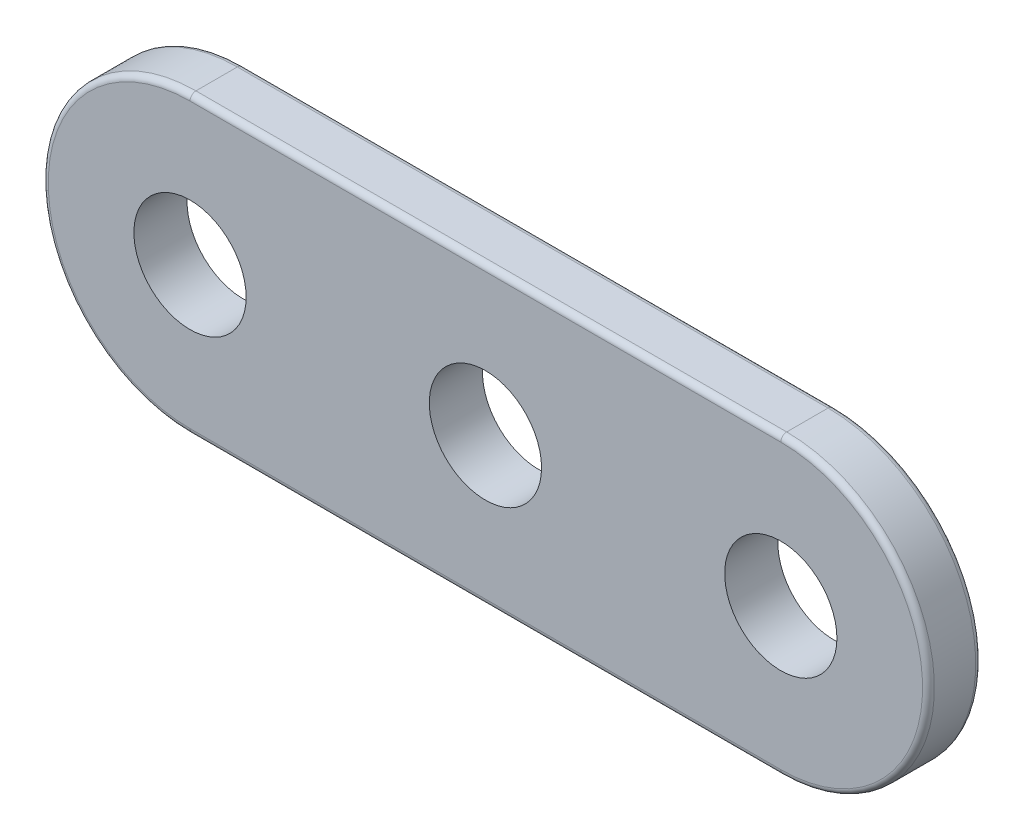
ISO-10303-21;
HEADER;
FILE_DESCRIPTION(('STEP AP214'),'2;1');
FILE_NAME('part.step','',(''),(''),'','','');
FILE_SCHEMA(('AUTOMOTIVE_DESIGN { 1 0 10303 214 1 1 1 1 }'));
ENDSEC;
DATA;
#1=APPLICATION_CONTEXT('core data for automotive mechanical design processes');
#2=APPLICATION_PROTOCOL_DEFINITION('international standard','automotive_design',2000,#1);
#3=PRODUCT_CONTEXT('',#1,'mechanical');
#4=PRODUCT('Part','Part','',(#3));
#5=PRODUCT_RELATED_PRODUCT_CATEGORY('part','',(#4));
#6=PRODUCT_DEFINITION_FORMATION('','',#4);
#7=PRODUCT_DEFINITION_CONTEXT('part definition',#1,'design');
#8=PRODUCT_DEFINITION('design','',#6,#7);
#9=PRODUCT_DEFINITION_SHAPE('','',#8);
#10=(LENGTH_UNIT() NAMED_UNIT(*) SI_UNIT(.MILLI.,.METRE.));
#11=(NAMED_UNIT(*) PLANE_ANGLE_UNIT() SI_UNIT($,.RADIAN.));
#12=(NAMED_UNIT(*) SI_UNIT($,.STERADIAN.) SOLID_ANGLE_UNIT());
#13=UNCERTAINTY_MEASURE_WITH_UNIT(LENGTH_MEASURE(1.E-05),#10,'distance_accuracy_value','');
#14=(GEOMETRIC_REPRESENTATION_CONTEXT(3) GLOBAL_UNCERTAINTY_ASSIGNED_CONTEXT((#13)) GLOBAL_UNIT_ASSIGNED_CONTEXT((#10,
#11,#12)) REPRESENTATION_CONTEXT('',''));
#15=CARTESIAN_POINT('',(0.,0.,0.));
#16=DIRECTION('',(0.,0.,1.));
#17=DIRECTION('',(1.,0.,0.));
#18=AXIS2_PLACEMENT_3D('',#15,#16,#17);
#19=CARTESIAN_POINT('',(-12.7,0.,2.286));
#20=DIRECTION('',(0.,0.,-1.));
#21=DIRECTION('',(-1.,0.,0.));
#22=AXIS2_PLACEMENT_3D('',#19,#20,#21);
#23=CYLINDRICAL_SURFACE('',#22,6.35);
#24=DIRECTION('',(0.,0.,-1.));
#25=VECTOR('',#24,1.);
#26=CARTESIAN_POINT('',(-12.7,6.35,2.286));
#27=LINE('',#26,#25);
#28=CARTESIAN_POINT('',(-12.7,6.35,2.032));
#29=VERTEX_POINT('',#28);
#30=CARTESIAN_POINT('',(-12.7,6.35,0.254));
#31=VERTEX_POINT('',#30);
#32=EDGE_CURVE('E102',#29,#31,#27,.T.);
#33=ORIENTED_EDGE('',*,*,#32,.T.);
#34=CARTESIAN_POINT('',(-12.7,0.,0.254));
#35=DIRECTION('',(0.,0.,1.));
#36=DIRECTION('',(1.,0.,0.));
#37=AXIS2_PLACEMENT_3D('',#34,#35,#36);
#38=CIRCLE('',#37,6.35);
#39=CARTESIAN_POINT('',(-12.7,-6.35,0.254));
#40=VERTEX_POINT('',#39);
#41=EDGE_CURVE('E199',#31,#40,#38,.T.);
#42=ORIENTED_EDGE('',*,*,#41,.T.);
#43=DIRECTION('',(0.,0.,-1.));
#44=VECTOR('',#43,1.);
#45=CARTESIAN_POINT('',(-12.7,-6.35,2.286));
#46=LINE('',#45,#44);
#47=CARTESIAN_POINT('',(-12.7,-6.35,2.032));
#48=VERTEX_POINT('',#47);
#49=EDGE_CURVE('E128',#48,#40,#46,.T.);
#50=ORIENTED_EDGE('',*,*,#49,.F.);
#51=CARTESIAN_POINT('',(-12.7,0.,2.032));
#52=DIRECTION('',(0.,0.,1.));
#53=DIRECTION('',(1.,0.,0.));
#54=AXIS2_PLACEMENT_3D('',#51,#52,#53);
#55=CIRCLE('',#54,6.35);
#56=EDGE_CURVE('E197',#48,#29,#55,.F.);
#57=ORIENTED_EDGE('',*,*,#56,.T.);
#58=EDGE_LOOP('',(#33,#42,#50,#57));
#59=FACE_BOUND('',#58,.T.);
#60=ADVANCED_FACE('F31',(#59),#23,.T.);
#61=CARTESIAN_POINT('',(-12.7,-6.35,2.286));
#62=DIRECTION('',(0.,1.,0.));
#63=DIRECTION('',(-1.,0.,0.));
#64=AXIS2_PLACEMENT_3D('',#61,#62,#63);
#65=PLANE('',#64);
#66=ORIENTED_EDGE('',*,*,#49,.T.);
#67=DIRECTION('',(1.,0.,0.));
#68=VECTOR('',#67,1.);
#69=CARTESIAN_POINT('',(-12.7,-6.35,0.254));
#70=LINE('',#69,#68);
#71=CARTESIAN_POINT('',(12.7,-6.35,0.254));
#72=VERTEX_POINT('',#71);
#73=EDGE_CURVE('E195',#40,#72,#70,.T.);
#74=ORIENTED_EDGE('',*,*,#73,.T.);
#75=DIRECTION('',(0.,0.,-1.));
#76=VECTOR('',#75,1.);
#77=CARTESIAN_POINT('',(12.7,-6.35,2.286));
#78=LINE('',#77,#76);
#79=CARTESIAN_POINT('',(12.7,-6.35,2.032));
#80=VERTEX_POINT('',#79);
#81=EDGE_CURVE('E119',#80,#72,#78,.T.);
#82=ORIENTED_EDGE('',*,*,#81,.F.);
#83=DIRECTION('',(1.,0.,0.));
#84=VECTOR('',#83,1.);
#85=CARTESIAN_POINT('',(-12.7,-6.35,2.032));
#86=LINE('',#85,#84);
#87=EDGE_CURVE('E193',#80,#48,#86,.F.);
#88=ORIENTED_EDGE('',*,*,#87,.T.);
#89=EDGE_LOOP('',(#66,#74,#82,#88));
#90=FACE_BOUND('',#89,.T.);
#91=ADVANCED_FACE('F211',(#90),#65,.F.);
#92=CARTESIAN_POINT('',(12.7,0.,2.286));
#93=DIRECTION('',(0.,0.,-1.));
#94=DIRECTION('',(-1.,0.,0.));
#95=AXIS2_PLACEMENT_3D('',#92,#93,#94);
#96=CYLINDRICAL_SURFACE('',#95,6.35);
#97=ORIENTED_EDGE('',*,*,#81,.T.);
#98=CARTESIAN_POINT('',(12.7,0.,0.254));
#99=DIRECTION('',(0.,0.,1.));
#100=DIRECTION('',(1.,0.,0.));
#101=AXIS2_PLACEMENT_3D('',#98,#99,#100);
#102=CIRCLE('',#101,6.35);
#103=CARTESIAN_POINT('',(12.7,6.35000000000001,0.254));
#104=VERTEX_POINT('',#103);
#105=EDGE_CURVE('E118',#72,#104,#102,.T.);
#106=ORIENTED_EDGE('',*,*,#105,.T.);
#107=DIRECTION('',(0.,0.,-1.));
#108=VECTOR('',#107,1.);
#109=CARTESIAN_POINT('',(12.7,6.35000000000001,2.286));
#110=LINE('',#109,#108);
#111=CARTESIAN_POINT('',(12.7,6.35000000000001,2.032));
#112=VERTEX_POINT('',#111);
#113=EDGE_CURVE('E100',#112,#104,#110,.T.);
#114=ORIENTED_EDGE('',*,*,#113,.F.);
#115=CARTESIAN_POINT('',(12.7,0.,2.032));
#116=DIRECTION('',(0.,0.,1.));
#117=DIRECTION('',(1.,0.,0.));
#118=AXIS2_PLACEMENT_3D('',#115,#116,#117);
#119=CIRCLE('',#118,6.35);
#120=EDGE_CURVE('E115',#112,#80,#119,.F.);
#121=ORIENTED_EDGE('',*,*,#120,.T.);
#122=EDGE_LOOP('',(#97,#106,#114,#121));
#123=FACE_BOUND('',#122,.T.);
#124=ADVANCED_FACE('F114',(#123),#96,.T.);
#125=CARTESIAN_POINT('',(-12.7,6.35,2.286));
#126=DIRECTION('',(0.,-1.,0.));
#127=DIRECTION('',(1.,0.,0.));
#128=AXIS2_PLACEMENT_3D('',#125,#126,#127);
#129=PLANE('',#128);
#130=ORIENTED_EDGE('',*,*,#113,.T.);
#131=DIRECTION('',(-1.,0.,0.));
#132=VECTOR('',#131,1.);
#133=CARTESIAN_POINT('',(-12.7,6.35,0.254));
#134=LINE('',#133,#132);
#135=EDGE_CURVE('E11',#104,#31,#134,.T.);
#136=ORIENTED_EDGE('',*,*,#135,.T.);
#137=ORIENTED_EDGE('',*,*,#32,.F.);
#138=DIRECTION('',(-1.,0.,0.));
#139=VECTOR('',#138,1.);
#140=CARTESIAN_POINT('',(12.7,6.35000000000001,2.032));
#141=LINE('',#140,#139);
#142=EDGE_CURVE('E40',#29,#112,#141,.F.);
#143=ORIENTED_EDGE('',*,*,#142,.T.);
#144=EDGE_LOOP('',(#130,#136,#137,#143));
#145=FACE_BOUND('',#144,.T.);
#146=ADVANCED_FACE('F99',(#145),#129,.F.);
#147=CARTESIAN_POINT('',(-12.7,0.,2.286));
#148=DIRECTION('',(0.,0.,1.));
#149=DIRECTION('',(1.,0.,0.));
#150=AXIS2_PLACEMENT_3D('',#147,#148,#149);
#151=PLANE('',#150);
#152=DIRECTION('',(1.,0.,0.));
#153=VECTOR('',#152,1.);
#154=CARTESIAN_POINT('',(12.7,-6.096,2.286));
#155=LINE('',#154,#153);
#156=CARTESIAN_POINT('',(-12.7,-6.09600000000001,2.286));
#157=VERTEX_POINT('',#156);
#158=CARTESIAN_POINT('',(12.7,-6.096,2.286));
#159=VERTEX_POINT('',#158);
#160=EDGE_CURVE('E48',#157,#159,#155,.T.);
#161=ORIENTED_EDGE('',*,*,#160,.T.);
#162=CARTESIAN_POINT('',(12.7,0.,2.286));
#163=DIRECTION('',(0.,0.,1.));
#164=DIRECTION('',(1.,0.,0.));
#165=AXIS2_PLACEMENT_3D('',#162,#163,#164);
#166=CIRCLE('',#165,6.09600000000001);
#167=CARTESIAN_POINT('',(12.7,6.09600000000001,2.286));
#168=VERTEX_POINT('',#167);
#169=EDGE_CURVE('E107',#159,#168,#166,.T.);
#170=ORIENTED_EDGE('',*,*,#169,.T.);
#171=DIRECTION('',(-1.,0.,0.));
#172=VECTOR('',#171,1.);
#173=CARTESIAN_POINT('',(-12.7,6.09600000000001,2.286));
#174=LINE('',#173,#172);
#175=CARTESIAN_POINT('',(-12.7,6.09600000000001,2.286));
#176=VERTEX_POINT('',#175);
#177=EDGE_CURVE('E131',#168,#176,#174,.T.);
#178=ORIENTED_EDGE('',*,*,#177,.T.);
#179=CARTESIAN_POINT('',(-12.7,0.,2.286));
#180=DIRECTION('',(0.,0.,1.));
#181=DIRECTION('',(1.,0.,0.));
#182=AXIS2_PLACEMENT_3D('',#179,#180,#181);
#183=CIRCLE('',#182,6.09600000000001);
#184=EDGE_CURVE('E53',#176,#157,#183,.T.);
#185=ORIENTED_EDGE('',*,*,#184,.T.);
#186=EDGE_LOOP('',(#161,#170,#178,#185));
#187=FACE_BOUND('',#186,.T.);
#188=CARTESIAN_POINT('',(12.7,0.,2.286));
#189=DIRECTION('',(0.,0.,1.));
#190=DIRECTION('',(1.,0.,0.));
#191=AXIS2_PLACEMENT_3D('',#188,#189,#190);
#192=CIRCLE('',#191,2.413);
#193=CARTESIAN_POINT('',(15.113,0.,2.286));
#194=VERTEX_POINT('',#193);
#195=EDGE_CURVE('E154',#194,#194,#192,.T.);
#196=ORIENTED_EDGE('',*,*,#195,.F.);
#197=EDGE_LOOP('',(#196));
#198=FACE_BOUND('',#197,.T.);
#199=CARTESIAN_POINT('',(0.,0.,2.286));
#200=DIRECTION('',(0.,0.,1.));
#201=DIRECTION('',(1.,0.,0.));
#202=AXIS2_PLACEMENT_3D('',#199,#200,#201);
#203=CIRCLE('',#202,2.413);
#204=CARTESIAN_POINT('',(2.413,0.,2.286));
#205=VERTEX_POINT('',#204);
#206=EDGE_CURVE('E165',#205,#205,#203,.T.);
#207=ORIENTED_EDGE('',*,*,#206,.F.);
#208=EDGE_LOOP('',(#207));
#209=FACE_BOUND('',#208,.T.);
#210=CARTESIAN_POINT('',(-12.7,0.,2.286));
#211=DIRECTION('',(0.,0.,1.));
#212=DIRECTION('',(1.,0.,0.));
#213=AXIS2_PLACEMENT_3D('',#210,#211,#212);
#214=CIRCLE('',#213,2.413);
#215=CARTESIAN_POINT('',(-10.287,0.,2.286));
#216=VERTEX_POINT('',#215);
#217=EDGE_CURVE('E171',#216,#216,#214,.T.);
#218=ORIENTED_EDGE('',*,*,#217,.F.);
#219=EDGE_LOOP('',(#218));
#220=FACE_BOUND('',#219,.T.);
#221=ADVANCED_FACE('F204',(#187,#198,#209,#220),#151,.T.);
#222=CARTESIAN_POINT('',(-12.7,0.,0.));
#223=DIRECTION('',(0.,0.,1.));
#224=DIRECTION('',(1.,0.,0.));
#225=AXIS2_PLACEMENT_3D('',#222,#223,#224);
#226=PLANE('',#225);
#227=DIRECTION('',(-1.,0.,0.));
#228=VECTOR('',#227,1.);
#229=CARTESIAN_POINT('',(-12.7,6.09600000000001,0.));
#230=LINE('',#229,#228);
#231=CARTESIAN_POINT('',(-12.7,6.09600000000001,0.));
#232=VERTEX_POINT('',#231);
#233=CARTESIAN_POINT('',(12.7,6.09600000000001,0.));
#234=VERTEX_POINT('',#233);
#235=EDGE_CURVE('E184',#232,#234,#230,.F.);
#236=ORIENTED_EDGE('',*,*,#235,.T.);
#237=CARTESIAN_POINT('',(12.7,0.,0.));
#238=DIRECTION('',(0.,0.,1.));
#239=DIRECTION('',(1.,0.,0.));
#240=AXIS2_PLACEMENT_3D('',#237,#238,#239);
#241=CIRCLE('',#240,6.09600000000001);
#242=CARTESIAN_POINT('',(12.7,-6.096,0.));
#243=VERTEX_POINT('',#242);
#244=EDGE_CURVE('E190',#234,#243,#241,.F.);
#245=ORIENTED_EDGE('',*,*,#244,.T.);
#246=DIRECTION('',(1.,0.,0.));
#247=VECTOR('',#246,1.);
#248=CARTESIAN_POINT('',(-12.7,-6.09600000000001,0.));
#249=LINE('',#248,#247);
#250=CARTESIAN_POINT('',(-12.7,-6.09600000000001,0.));
#251=VERTEX_POINT('',#250);
#252=EDGE_CURVE('E188',#243,#251,#249,.F.);
#253=ORIENTED_EDGE('',*,*,#252,.T.);
#254=CARTESIAN_POINT('',(-12.7,0.,0.));
#255=DIRECTION('',(0.,0.,1.));
#256=DIRECTION('',(1.,0.,0.));
#257=AXIS2_PLACEMENT_3D('',#254,#255,#256);
#258=CIRCLE('',#257,6.09600000000001);
#259=EDGE_CURVE('E186',#251,#232,#258,.F.);
#260=ORIENTED_EDGE('',*,*,#259,.T.);
#261=EDGE_LOOP('',(#236,#245,#253,#260));
#262=FACE_BOUND('',#261,.T.);
#263=CARTESIAN_POINT('',(12.7,0.,0.));
#264=DIRECTION('',(0.,0.,1.));
#265=DIRECTION('',(1.,0.,0.));
#266=AXIS2_PLACEMENT_3D('',#263,#264,#265);
#267=CIRCLE('',#266,2.413);
#268=CARTESIAN_POINT('',(15.113,0.,0.));
#269=VERTEX_POINT('',#268);
#270=EDGE_CURVE('E160',#269,#269,#267,.T.);
#271=ORIENTED_EDGE('',*,*,#270,.T.);
#272=EDGE_LOOP('',(#271));
#273=FACE_BOUND('',#272,.T.);
#274=CARTESIAN_POINT('',(0.,0.,0.));
#275=DIRECTION('',(0.,0.,1.));
#276=DIRECTION('',(1.,0.,0.));
#277=AXIS2_PLACEMENT_3D('',#274,#275,#276);
#278=CIRCLE('',#277,2.413);
#279=CARTESIAN_POINT('',(2.413,0.,0.));
#280=VERTEX_POINT('',#279);
#281=EDGE_CURVE('E168',#280,#280,#278,.T.);
#282=ORIENTED_EDGE('',*,*,#281,.T.);
#283=EDGE_LOOP('',(#282));
#284=FACE_BOUND('',#283,.T.);
#285=CARTESIAN_POINT('',(-12.7,0.,0.));
#286=DIRECTION('',(0.,0.,1.));
#287=DIRECTION('',(1.,0.,0.));
#288=AXIS2_PLACEMENT_3D('',#285,#286,#287);
#289=CIRCLE('',#288,2.413);
#290=CARTESIAN_POINT('',(-10.287,0.,0.));
#291=VERTEX_POINT('',#290);
#292=EDGE_CURVE('E174',#291,#291,#289,.T.);
#293=ORIENTED_EDGE('',*,*,#292,.T.);
#294=EDGE_LOOP('',(#293));
#295=FACE_BOUND('',#294,.T.);
#296=ADVANCED_FACE('F239',(#262,#273,#284,#295),#226,.F.);
#297=CARTESIAN_POINT('',(-12.7,0.,0.));
#298=DIRECTION('',(0.,0.,1.));
#299=DIRECTION('',(1.,0.,0.));
#300=AXIS2_PLACEMENT_3D('',#297,#298,#299);
#301=CYLINDRICAL_SURFACE('',#300,2.413);
#302=ORIENTED_EDGE('',*,*,#292,.F.);
#303=EDGE_LOOP('',(#302));
#304=FACE_BOUND('',#303,.T.);
#305=ORIENTED_EDGE('',*,*,#217,.T.);
#306=EDGE_LOOP('',(#305));
#307=FACE_BOUND('',#306,.T.);
#308=ADVANCED_FACE('F242',(#304,#307),#301,.F.);
#309=CARTESIAN_POINT('',(0.,0.,0.));
#310=DIRECTION('',(0.,0.,1.));
#311=DIRECTION('',(1.,0.,0.));
#312=AXIS2_PLACEMENT_3D('',#309,#310,#311);
#313=CYLINDRICAL_SURFACE('',#312,2.413);
#314=ORIENTED_EDGE('',*,*,#281,.F.);
#315=EDGE_LOOP('',(#314));
#316=FACE_BOUND('',#315,.T.);
#317=ORIENTED_EDGE('',*,*,#206,.T.);
#318=EDGE_LOOP('',(#317));
#319=FACE_BOUND('',#318,.T.);
#320=ADVANCED_FACE('F248',(#316,#319),#313,.F.);
#321=CARTESIAN_POINT('',(12.7,0.,0.));
#322=DIRECTION('',(0.,0.,1.));
#323=DIRECTION('',(1.,0.,0.));
#324=AXIS2_PLACEMENT_3D('',#321,#322,#323);
#325=CYLINDRICAL_SURFACE('',#324,2.413);
#326=ORIENTED_EDGE('',*,*,#270,.F.);
#327=EDGE_LOOP('',(#326));
#328=FACE_BOUND('',#327,.T.);
#329=ORIENTED_EDGE('',*,*,#195,.T.);
#330=EDGE_LOOP('',(#329));
#331=FACE_BOUND('',#330,.T.);
#332=ADVANCED_FACE('F252',(#328,#331),#325,.F.);
#333=CARTESIAN_POINT('',(-12.7,0.,0.254));
#334=DIRECTION('',(0.,0.,1.));
#335=DIRECTION('',(1.,0.,0.));
#336=AXIS2_PLACEMENT_3D('',#333,#334,#335);
#337=TOROIDAL_SURFACE('',#336,6.09600000000001,0.254);
#338=CARTESIAN_POINT('',(-12.7,6.09600000000001,0.254));
#339=DIRECTION('',(1.,0.,0.));
#340=DIRECTION('',(0.,0.,-1.));
#341=AXIS2_PLACEMENT_3D('',#338,#339,#340);
#342=CIRCLE('',#341,0.254);
#343=EDGE_CURVE('E147',#232,#31,#342,.T.);
#344=ORIENTED_EDGE('',*,*,#343,.F.);
#345=ORIENTED_EDGE('',*,*,#259,.F.);
#346=CARTESIAN_POINT('',(-12.7,-6.09600000000001,0.254));
#347=DIRECTION('',(1.,0.,0.));
#348=DIRECTION('',(0.,0.,-1.));
#349=AXIS2_PLACEMENT_3D('',#346,#347,#348);
#350=CIRCLE('',#349,0.254);
#351=EDGE_CURVE('E136',#40,#251,#350,.T.);
#352=ORIENTED_EDGE('',*,*,#351,.F.);
#353=ORIENTED_EDGE('',*,*,#41,.F.);
#354=EDGE_LOOP('',(#344,#345,#352,#353));
#355=FACE_BOUND('',#354,.T.);
#356=ADVANCED_FACE('F215',(#355),#337,.T.);
#357=CARTESIAN_POINT('',(-12.7,-6.09600000000001,0.254));
#358=DIRECTION('',(1.,0.,0.));
#359=DIRECTION('',(0.,1.,0.));
#360=AXIS2_PLACEMENT_3D('',#357,#358,#359);
#361=CYLINDRICAL_SURFACE('',#360,0.254);
#362=ORIENTED_EDGE('',*,*,#351,.T.);
#363=ORIENTED_EDGE('',*,*,#252,.F.);
#364=CARTESIAN_POINT('',(12.7,-6.096,0.254));
#365=DIRECTION('',(1.,0.,0.));
#366=DIRECTION('',(0.,0.,-1.));
#367=AXIS2_PLACEMENT_3D('',#364,#365,#366);
#368=CIRCLE('',#367,0.254);
#369=EDGE_CURVE('E141',#72,#243,#368,.T.);
#370=ORIENTED_EDGE('',*,*,#369,.F.);
#371=ORIENTED_EDGE('',*,*,#73,.F.);
#372=EDGE_LOOP('',(#362,#363,#370,#371));
#373=FACE_BOUND('',#372,.T.);
#374=ADVANCED_FACE('F218',(#373),#361,.T.);
#375=CARTESIAN_POINT('',(-12.7,6.09600000000001,0.254));
#376=DIRECTION('',(-1.,0.,0.));
#377=DIRECTION('',(0.,-1.,0.));
#378=AXIS2_PLACEMENT_3D('',#375,#376,#377);
#379=CYLINDRICAL_SURFACE('',#378,0.254);
#380=ORIENTED_EDGE('',*,*,#343,.T.);
#381=ORIENTED_EDGE('',*,*,#135,.F.);
#382=CARTESIAN_POINT('',(12.7,6.09600000000001,0.254));
#383=DIRECTION('',(1.,0.,0.));
#384=DIRECTION('',(0.,0.,-1.));
#385=AXIS2_PLACEMENT_3D('',#382,#383,#384);
#386=CIRCLE('',#385,0.254);
#387=EDGE_CURVE('E139',#234,#104,#386,.T.);
#388=ORIENTED_EDGE('',*,*,#387,.F.);
#389=ORIENTED_EDGE('',*,*,#235,.F.);
#390=EDGE_LOOP('',(#380,#381,#388,#389));
#391=FACE_BOUND('',#390,.T.);
#392=ADVANCED_FACE('F221',(#391),#379,.T.);
#393=CARTESIAN_POINT('',(12.7,0.,0.254));
#394=DIRECTION('',(0.,0.,1.));
#395=DIRECTION('',(1.,0.,0.));
#396=AXIS2_PLACEMENT_3D('',#393,#394,#395);
#397=TOROIDAL_SURFACE('',#396,6.09600000000001,0.254);
#398=ORIENTED_EDGE('',*,*,#369,.T.);
#399=ORIENTED_EDGE('',*,*,#244,.F.);
#400=ORIENTED_EDGE('',*,*,#387,.T.);
#401=ORIENTED_EDGE('',*,*,#105,.F.);
#402=EDGE_LOOP('',(#398,#399,#400,#401));
#403=FACE_BOUND('',#402,.T.);
#404=ADVANCED_FACE('F219',(#403),#397,.T.);
#405=CARTESIAN_POINT('',(-12.7,0.,2.032));
#406=DIRECTION('',(0.,0.,1.));
#407=DIRECTION('',(1.,0.,0.));
#408=AXIS2_PLACEMENT_3D('',#405,#406,#407);
#409=TOROIDAL_SURFACE('',#408,6.09600000000001,0.254);
#410=CARTESIAN_POINT('',(-12.7,6.09600000000001,2.032));
#411=DIRECTION('',(1.,0.,0.));
#412=DIRECTION('',(0.,0.,-1.));
#413=AXIS2_PLACEMENT_3D('',#410,#411,#412);
#414=CIRCLE('',#413,0.254);
#415=EDGE_CURVE('E133',#29,#176,#414,.T.);
#416=ORIENTED_EDGE('',*,*,#415,.F.);
#417=ORIENTED_EDGE('',*,*,#56,.F.);
#418=CARTESIAN_POINT('',(-12.7,-6.09600000000001,2.032));
#419=DIRECTION('',(1.,0.,0.));
#420=DIRECTION('',(0.,0.,-1.));
#421=AXIS2_PLACEMENT_3D('',#418,#419,#420);
#422=CIRCLE('',#421,0.254);
#423=EDGE_CURVE('E35',#157,#48,#422,.T.);
#424=ORIENTED_EDGE('',*,*,#423,.F.);
#425=ORIENTED_EDGE('',*,*,#184,.F.);
#426=EDGE_LOOP('',(#416,#417,#424,#425));
#427=FACE_BOUND('',#426,.T.);
#428=ADVANCED_FACE('F33',(#427),#409,.T.);
#429=CARTESIAN_POINT('',(-12.7,-6.09600000000001,2.032));
#430=DIRECTION('',(-1.,0.,0.));
#431=DIRECTION('',(0.,-1.,0.));
#432=AXIS2_PLACEMENT_3D('',#429,#430,#431);
#433=CYLINDRICAL_SURFACE('',#432,0.254);
#434=ORIENTED_EDGE('',*,*,#423,.T.);
#435=ORIENTED_EDGE('',*,*,#87,.F.);
#436=CARTESIAN_POINT('',(12.7,-6.096,2.032));
#437=DIRECTION('',(1.,0.,0.));
#438=DIRECTION('',(0.,0.,-1.));
#439=AXIS2_PLACEMENT_3D('',#436,#437,#438);
#440=CIRCLE('',#439,0.254);
#441=EDGE_CURVE('E126',#159,#80,#440,.T.);
#442=ORIENTED_EDGE('',*,*,#441,.F.);
#443=ORIENTED_EDGE('',*,*,#160,.F.);
#444=EDGE_LOOP('',(#434,#435,#442,#443));
#445=FACE_BOUND('',#444,.T.);
#446=ADVANCED_FACE('F208',(#445),#433,.T.);
#447=CARTESIAN_POINT('',(-12.7,6.09600000000001,2.032));
#448=DIRECTION('',(1.,0.,0.));
#449=DIRECTION('',(0.,1.,0.));
#450=AXIS2_PLACEMENT_3D('',#447,#448,#449);
#451=CYLINDRICAL_SURFACE('',#450,0.254);
#452=ORIENTED_EDGE('',*,*,#415,.T.);
#453=ORIENTED_EDGE('',*,*,#177,.F.);
#454=CARTESIAN_POINT('',(12.7,6.09600000000001,2.032));
#455=DIRECTION('',(1.,0.,0.));
#456=DIRECTION('',(0.,0.,-1.));
#457=AXIS2_PLACEMENT_3D('',#454,#455,#456);
#458=CIRCLE('',#457,0.254);
#459=EDGE_CURVE('E124',#112,#168,#458,.T.);
#460=ORIENTED_EDGE('',*,*,#459,.F.);
#461=ORIENTED_EDGE('',*,*,#142,.F.);
#462=EDGE_LOOP('',(#452,#453,#460,#461));
#463=FACE_BOUND('',#462,.T.);
#464=ADVANCED_FACE('F130',(#463),#451,.T.);
#465=CARTESIAN_POINT('',(12.7,0.,2.032));
#466=DIRECTION('',(0.,0.,1.));
#467=DIRECTION('',(1.,0.,0.));
#468=AXIS2_PLACEMENT_3D('',#465,#466,#467);
#469=TOROIDAL_SURFACE('',#468,6.09600000000001,0.254);
#470=ORIENTED_EDGE('',*,*,#441,.T.);
#471=ORIENTED_EDGE('',*,*,#120,.F.);
#472=ORIENTED_EDGE('',*,*,#459,.T.);
#473=ORIENTED_EDGE('',*,*,#169,.F.);
#474=EDGE_LOOP('',(#470,#471,#472,#473));
#475=FACE_BOUND('',#474,.T.);
#476=ADVANCED_FACE('F122',(#475),#469,.T.);
#477=CLOSED_SHELL('',(#60,#91,#124,#146,#221,#296,#308,#320,#332,#356,#374,#392,#404,#428,#446,
#464,#476));
#478=MANIFOLD_SOLID_BREP('B2',#477);
#479=ADVANCED_BREP_SHAPE_REPRESENTATION('',(#18,#478),#14);
#480=SHAPE_DEFINITION_REPRESENTATION(#9,#479);
ENDSEC;
END-ISO-10303-21;
